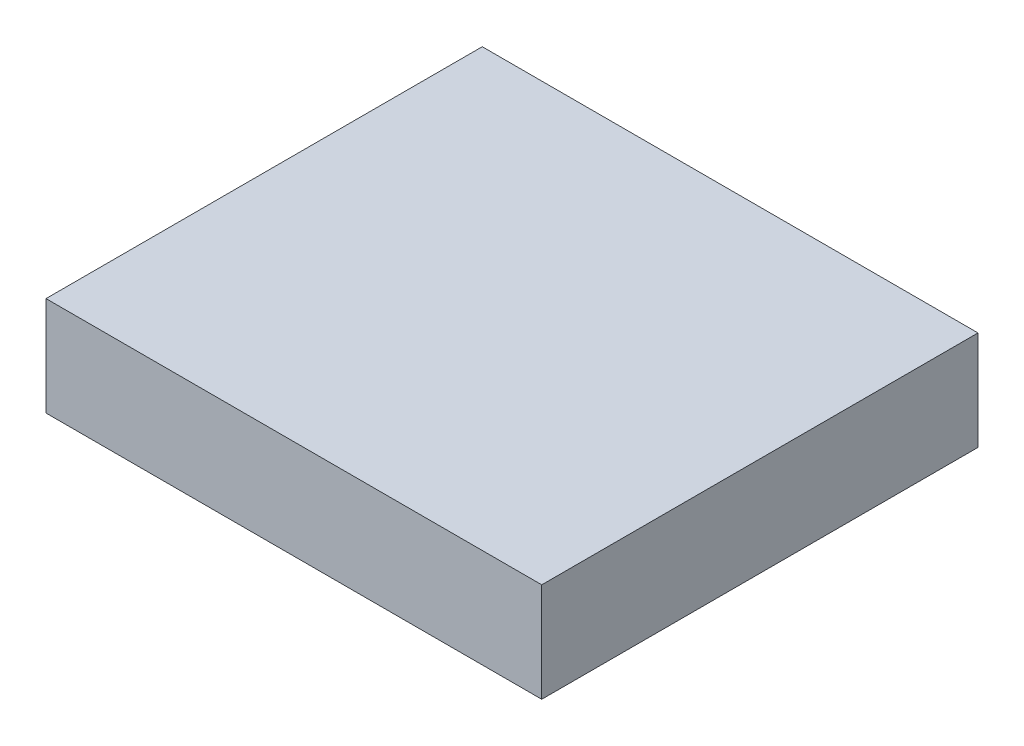
ISO-10303-21;
HEADER;
FILE_DESCRIPTION(('STEP AP214'),'2;1');
FILE_NAME('part.step','',(''),(''),'','','');
FILE_SCHEMA(('AUTOMOTIVE_DESIGN { 1 0 10303 214 1 1 1 1 }'));
ENDSEC;
DATA;
#1=APPLICATION_CONTEXT('core data for automotive mechanical design processes');
#2=APPLICATION_PROTOCOL_DEFINITION('international standard','automotive_design',2000,#1);
#3=PRODUCT_CONTEXT('',#1,'mechanical');
#4=PRODUCT('Part','Part','',(#3));
#5=PRODUCT_RELATED_PRODUCT_CATEGORY('part','',(#4));
#6=PRODUCT_DEFINITION_FORMATION('','',#4);
#7=PRODUCT_DEFINITION_CONTEXT('part definition',#1,'design');
#8=PRODUCT_DEFINITION('design','',#6,#7);
#9=PRODUCT_DEFINITION_SHAPE('','',#8);
#10=(LENGTH_UNIT() NAMED_UNIT(*) SI_UNIT(.MILLI.,.METRE.));
#11=(NAMED_UNIT(*) PLANE_ANGLE_UNIT() SI_UNIT($,.RADIAN.));
#12=(NAMED_UNIT(*) SI_UNIT($,.STERADIAN.) SOLID_ANGLE_UNIT());
#13=UNCERTAINTY_MEASURE_WITH_UNIT(LENGTH_MEASURE(1.E-05),#10,'distance_accuracy_value','');
#14=(GEOMETRIC_REPRESENTATION_CONTEXT(3) GLOBAL_UNCERTAINTY_ASSIGNED_CONTEXT((#13)) GLOBAL_UNIT_ASSIGNED_CONTEXT((#10,
#11,#12)) REPRESENTATION_CONTEXT('',''));
#15=CARTESIAN_POINT('',(0.,0.,0.));
#16=DIRECTION('',(0.,0.,1.));
#17=DIRECTION('',(1.,0.,0.));
#18=AXIS2_PLACEMENT_3D('',#15,#16,#17);
#19=CARTESIAN_POINT('',(0.,1.,0.));
#20=DIRECTION('',(1.,0.,0.));
#21=DIRECTION('',(0.,0.,-1.));
#22=AXIS2_PLACEMENT_3D('',#19,#20,#21);
#23=PLANE('',#22);
#24=DIRECTION('',(0.,0.,1.));
#25=VECTOR('',#24,1.);
#26=CARTESIAN_POINT('',(0.,0.,0.));
#27=LINE('',#26,#25);
#28=CARTESIAN_POINT('',(0.,0.,0.));
#29=VERTEX_POINT('',#28);
#30=CARTESIAN_POINT('',(0.,0.,4.4));
#31=VERTEX_POINT('',#30);
#32=EDGE_CURVE('E107',#29,#31,#27,.T.);
#33=ORIENTED_EDGE('',*,*,#32,.T.);
#34=DIRECTION('',(0.,-1.,0.));
#35=VECTOR('',#34,1.);
#36=CARTESIAN_POINT('',(0.,1.,4.4));
#37=LINE('',#36,#35);
#38=CARTESIAN_POINT('',(0.,1.,4.4));
#39=VERTEX_POINT('',#38);
#40=EDGE_CURVE('E11',#39,#31,#37,.T.);
#41=ORIENTED_EDGE('',*,*,#40,.F.);
#42=DIRECTION('',(0.,0.,1.));
#43=VECTOR('',#42,1.);
#44=CARTESIAN_POINT('',(0.,1.,0.));
#45=LINE('',#44,#43);
#46=CARTESIAN_POINT('',(0.,1.,0.));
#47=VERTEX_POINT('',#46);
#48=EDGE_CURVE('E91',#47,#39,#45,.T.);
#49=ORIENTED_EDGE('',*,*,#48,.F.);
#50=DIRECTION('',(0.,-1.,0.));
#51=VECTOR('',#50,1.);
#52=CARTESIAN_POINT('',(0.,1.,0.));
#53=LINE('',#52,#51);
#54=EDGE_CURVE('E103',#47,#29,#53,.T.);
#55=ORIENTED_EDGE('',*,*,#54,.T.);
#56=EDGE_LOOP('',(#33,#41,#49,#55));
#57=FACE_BOUND('',#56,.T.);
#58=ADVANCED_FACE('F39',(#57),#23,.F.);
#59=CARTESIAN_POINT('',(0.,1.,4.4));
#60=DIRECTION('',(0.,0.,-1.));
#61=DIRECTION('',(-1.,0.,0.));
#62=AXIS2_PLACEMENT_3D('',#59,#60,#61);
#63=PLANE('',#62);
#64=DIRECTION('',(1.,0.,0.));
#65=VECTOR('',#64,1.);
#66=CARTESIAN_POINT('',(0.,0.,4.4));
#67=LINE('',#66,#65);
#68=CARTESIAN_POINT('',(5.,0.,4.4));
#69=VERTEX_POINT('',#68);
#70=EDGE_CURVE('E96',#31,#69,#67,.T.);
#71=ORIENTED_EDGE('',*,*,#70,.T.);
#72=DIRECTION('',(0.,-1.,0.));
#73=VECTOR('',#72,1.);
#74=CARTESIAN_POINT('',(5.,1.,4.4));
#75=LINE('',#74,#73);
#76=CARTESIAN_POINT('',(5.,1.,4.4));
#77=VERTEX_POINT('',#76);
#78=EDGE_CURVE('E48',#77,#69,#75,.T.);
#79=ORIENTED_EDGE('',*,*,#78,.F.);
#80=DIRECTION('',(1.,0.,0.));
#81=VECTOR('',#80,1.);
#82=CARTESIAN_POINT('',(0.,1.,4.4));
#83=LINE('',#82,#81);
#84=EDGE_CURVE('E86',#39,#77,#83,.T.);
#85=ORIENTED_EDGE('',*,*,#84,.F.);
#86=ORIENTED_EDGE('',*,*,#40,.T.);
#87=EDGE_LOOP('',(#71,#79,#85,#86));
#88=FACE_BOUND('',#87,.T.);
#89=ADVANCED_FACE('F95',(#88),#63,.F.);
#90=CARTESIAN_POINT('',(5.,1.,0.));
#91=DIRECTION('',(-1.,0.,0.));
#92=DIRECTION('',(0.,0.,1.));
#93=AXIS2_PLACEMENT_3D('',#90,#91,#92);
#94=PLANE('',#93);
#95=DIRECTION('',(0.,0.,-1.));
#96=VECTOR('',#95,1.);
#97=CARTESIAN_POINT('',(5.,0.,0.));
#98=LINE('',#97,#96);
#99=CARTESIAN_POINT('',(5.,0.,0.));
#100=VERTEX_POINT('',#99);
#101=EDGE_CURVE('E73',#69,#100,#98,.T.);
#102=ORIENTED_EDGE('',*,*,#101,.T.);
#103=DIRECTION('',(0.,-1.,0.));
#104=VECTOR('',#103,1.);
#105=CARTESIAN_POINT('',(5.,1.,0.));
#106=LINE('',#105,#104);
#107=CARTESIAN_POINT('',(5.,1.,0.));
#108=VERTEX_POINT('',#107);
#109=EDGE_CURVE('E98',#108,#100,#106,.T.);
#110=ORIENTED_EDGE('',*,*,#109,.F.);
#111=DIRECTION('',(0.,0.,-1.));
#112=VECTOR('',#111,1.);
#113=CARTESIAN_POINT('',(5.,1.,0.));
#114=LINE('',#113,#112);
#115=EDGE_CURVE('E89',#77,#108,#114,.T.);
#116=ORIENTED_EDGE('',*,*,#115,.F.);
#117=ORIENTED_EDGE('',*,*,#78,.T.);
#118=EDGE_LOOP('',(#102,#110,#116,#117));
#119=FACE_BOUND('',#118,.T.);
#120=ADVANCED_FACE('F99',(#119),#94,.F.);
#121=CARTESIAN_POINT('',(0.,1.,0.));
#122=DIRECTION('',(0.,0.,1.));
#123=DIRECTION('',(1.,0.,0.));
#124=AXIS2_PLACEMENT_3D('',#121,#122,#123);
#125=PLANE('',#124);
#126=DIRECTION('',(-1.,0.,0.));
#127=VECTOR('',#126,1.);
#128=CARTESIAN_POINT('',(0.,0.,0.));
#129=LINE('',#128,#127);
#130=EDGE_CURVE('E79',#100,#29,#129,.T.);
#131=ORIENTED_EDGE('',*,*,#130,.T.);
#132=ORIENTED_EDGE('',*,*,#54,.F.);
#133=DIRECTION('',(-1.,0.,0.));
#134=VECTOR('',#133,1.);
#135=CARTESIAN_POINT('',(0.,1.,0.));
#136=LINE('',#135,#134);
#137=EDGE_CURVE('E56',#108,#47,#136,.T.);
#138=ORIENTED_EDGE('',*,*,#137,.F.);
#139=ORIENTED_EDGE('',*,*,#109,.T.);
#140=EDGE_LOOP('',(#131,#132,#138,#139));
#141=FACE_BOUND('',#140,.T.);
#142=ADVANCED_FACE('F120',(#141),#125,.F.);
#143=CARTESIAN_POINT('',(0.,1.,0.));
#144=DIRECTION('',(0.,1.,0.));
#145=DIRECTION('',(0.,0.,1.));
#146=AXIS2_PLACEMENT_3D('',#143,#144,#145);
#147=PLANE('',#146);
#148=ORIENTED_EDGE('',*,*,#48,.T.);
#149=ORIENTED_EDGE('',*,*,#84,.T.);
#150=ORIENTED_EDGE('',*,*,#115,.T.);
#151=ORIENTED_EDGE('',*,*,#137,.T.);
#152=EDGE_LOOP('',(#148,#149,#150,#151));
#153=FACE_BOUND('',#152,.T.);
#154=ADVANCED_FACE('F87',(#153),#147,.T.);
#155=CARTESIAN_POINT('',(0.,0.,0.));
#156=DIRECTION('',(0.,1.,0.));
#157=DIRECTION('',(0.,0.,1.));
#158=AXIS2_PLACEMENT_3D('',#155,#156,#157);
#159=PLANE('',#158);
#160=ORIENTED_EDGE('',*,*,#32,.F.);
#161=ORIENTED_EDGE('',*,*,#130,.F.);
#162=ORIENTED_EDGE('',*,*,#101,.F.);
#163=ORIENTED_EDGE('',*,*,#70,.F.);
#164=EDGE_LOOP('',(#160,#161,#162,#163));
#165=FACE_BOUND('',#164,.T.);
#166=ADVANCED_FACE('F123',(#165),#159,.F.);
#167=CLOSED_SHELL('',(#58,#89,#120,#142,#154,#166));
#168=MANIFOLD_SOLID_BREP('B2',#167);
#169=ADVANCED_BREP_SHAPE_REPRESENTATION('',(#18,#168),#14);
#170=SHAPE_DEFINITION_REPRESENTATION(#9,#169);
ENDSEC;
END-ISO-10303-21;
